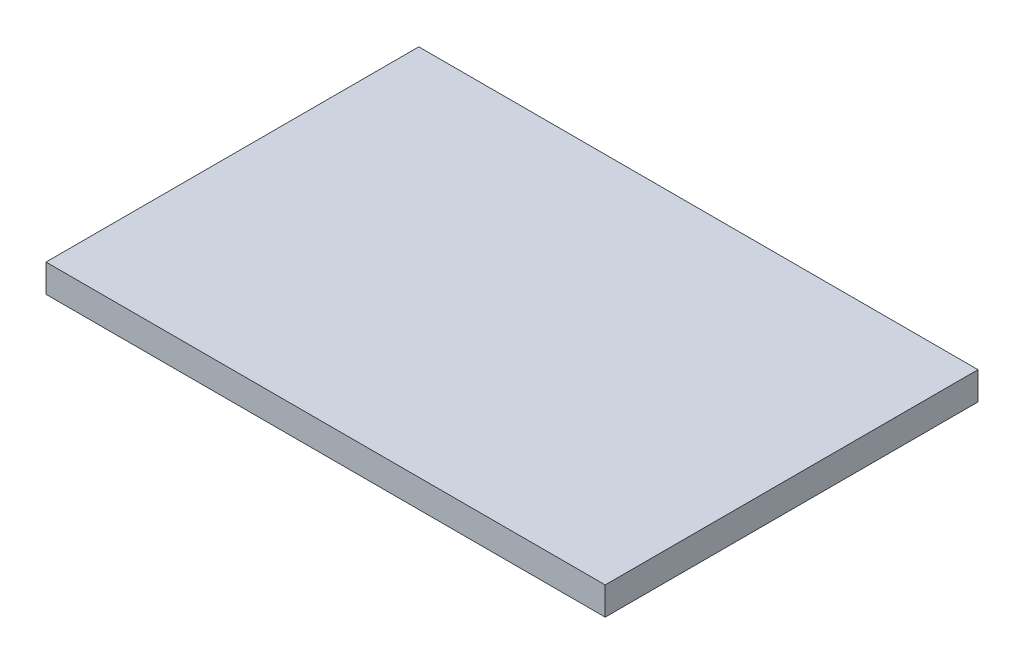
ISO-10303-21;
HEADER;
FILE_DESCRIPTION(('STEP AP214'),'2;1');
FILE_NAME('part.step','',(''),(''),'','','');
FILE_SCHEMA(('AUTOMOTIVE_DESIGN { 1 0 10303 214 1 1 1 1 }'));
ENDSEC;
DATA;
#1=APPLICATION_CONTEXT('core data for automotive mechanical design processes');
#2=APPLICATION_PROTOCOL_DEFINITION('international standard','automotive_design',2000,#1);
#3=PRODUCT_CONTEXT('',#1,'mechanical');
#4=PRODUCT('Part','Part','',(#3));
#5=PRODUCT_RELATED_PRODUCT_CATEGORY('part','',(#4));
#6=PRODUCT_DEFINITION_FORMATION('','',#4);
#7=PRODUCT_DEFINITION_CONTEXT('part definition',#1,'design');
#8=PRODUCT_DEFINITION('design','',#6,#7);
#9=PRODUCT_DEFINITION_SHAPE('','',#8);
#10=(LENGTH_UNIT() NAMED_UNIT(*) SI_UNIT(.MILLI.,.METRE.));
#11=(NAMED_UNIT(*) PLANE_ANGLE_UNIT() SI_UNIT($,.RADIAN.));
#12=(NAMED_UNIT(*) SI_UNIT($,.STERADIAN.) SOLID_ANGLE_UNIT());
#13=UNCERTAINTY_MEASURE_WITH_UNIT(LENGTH_MEASURE(1.E-05),#10,'distance_accuracy_value','');
#14=(GEOMETRIC_REPRESENTATION_CONTEXT(3) GLOBAL_UNCERTAINTY_ASSIGNED_CONTEXT((#13)) GLOBAL_UNIT_ASSIGNED_CONTEXT((#10,
#11,#12)) REPRESENTATION_CONTEXT('',''));
#15=CARTESIAN_POINT('',(0.,0.,0.));
#16=DIRECTION('',(0.,0.,1.));
#17=DIRECTION('',(1.,0.,0.));
#18=AXIS2_PLACEMENT_3D('',#15,#16,#17);
#19=CARTESIAN_POINT('',(30.,3.,-20.));
#20=DIRECTION('',(-1.,0.,0.));
#21=DIRECTION('',(0.,0.,1.));
#22=AXIS2_PLACEMENT_3D('',#19,#20,#21);
#23=PLANE('',#22);
#24=DIRECTION('',(0.,0.,-1.));
#25=VECTOR('',#24,1.);
#26=CARTESIAN_POINT('',(30.,0.,-20.));
#27=LINE('',#26,#25);
#28=CARTESIAN_POINT('',(30.,0.,20.));
#29=VERTEX_POINT('',#28);
#30=CARTESIAN_POINT('',(30.,0.,-20.));
#31=VERTEX_POINT('',#30);
#32=EDGE_CURVE('E96',#29,#31,#27,.T.);
#33=ORIENTED_EDGE('',*,*,#32,.T.);
#34=DIRECTION('',(0.,-1.,0.));
#35=VECTOR('',#34,1.);
#36=CARTESIAN_POINT('',(30.,3.,-20.));
#37=LINE('',#36,#35);
#38=CARTESIAN_POINT('',(30.,3.,-20.));
#39=VERTEX_POINT('',#38);
#40=EDGE_CURVE('E11',#39,#31,#37,.T.);
#41=ORIENTED_EDGE('',*,*,#40,.F.);
#42=DIRECTION('',(0.,0.,-1.));
#43=VECTOR('',#42,1.);
#44=CARTESIAN_POINT('',(30.,3.,-20.));
#45=LINE('',#44,#43);
#46=CARTESIAN_POINT('',(30.,3.,20.));
#47=VERTEX_POINT('',#46);
#48=EDGE_CURVE('E84',#47,#39,#45,.T.);
#49=ORIENTED_EDGE('',*,*,#48,.F.);
#50=DIRECTION('',(0.,-1.,0.));
#51=VECTOR('',#50,1.);
#52=CARTESIAN_POINT('',(30.,3.,20.));
#53=LINE('',#52,#51);
#54=EDGE_CURVE('E92',#47,#29,#53,.T.);
#55=ORIENTED_EDGE('',*,*,#54,.T.);
#56=EDGE_LOOP('',(#33,#41,#49,#55));
#57=FACE_BOUND('',#56,.T.);
#58=ADVANCED_FACE('F33',(#57),#23,.F.);
#59=CARTESIAN_POINT('',(-30.,3.,-20.));
#60=DIRECTION('',(0.,0.,1.));
#61=DIRECTION('',(1.,0.,0.));
#62=AXIS2_PLACEMENT_3D('',#59,#60,#61);
#63=PLANE('',#62);
#64=DIRECTION('',(-1.,0.,0.));
#65=VECTOR('',#64,1.);
#66=CARTESIAN_POINT('',(-30.,0.,-20.));
#67=LINE('',#66,#65);
#68=CARTESIAN_POINT('',(-30.,0.,-20.));
#69=VERTEX_POINT('',#68);
#70=EDGE_CURVE('E88',#31,#69,#67,.T.);
#71=ORIENTED_EDGE('',*,*,#70,.T.);
#72=DIRECTION('',(0.,-1.,0.));
#73=VECTOR('',#72,1.);
#74=CARTESIAN_POINT('',(-30.,3.,-20.));
#75=LINE('',#74,#73);
#76=CARTESIAN_POINT('',(-30.,3.,-20.));
#77=VERTEX_POINT('',#76);
#78=EDGE_CURVE('E41',#77,#69,#75,.T.);
#79=ORIENTED_EDGE('',*,*,#78,.F.);
#80=DIRECTION('',(-1.,0.,0.));
#81=VECTOR('',#80,1.);
#82=CARTESIAN_POINT('',(-30.,3.,-20.));
#83=LINE('',#82,#81);
#84=EDGE_CURVE('E79',#39,#77,#83,.T.);
#85=ORIENTED_EDGE('',*,*,#84,.F.);
#86=ORIENTED_EDGE('',*,*,#40,.T.);
#87=EDGE_LOOP('',(#71,#79,#85,#86));
#88=FACE_BOUND('',#87,.T.);
#89=ADVANCED_FACE('F87',(#88),#63,.F.);
#90=CARTESIAN_POINT('',(-30.,3.,-20.));
#91=DIRECTION('',(1.,0.,0.));
#92=DIRECTION('',(0.,0.,-1.));
#93=AXIS2_PLACEMENT_3D('',#90,#91,#92);
#94=PLANE('',#93);
#95=DIRECTION('',(0.,0.,1.));
#96=VECTOR('',#95,1.);
#97=CARTESIAN_POINT('',(-30.,0.,-20.));
#98=LINE('',#97,#96);
#99=CARTESIAN_POINT('',(-30.,0.,20.));
#100=VERTEX_POINT('',#99);
#101=EDGE_CURVE('E66',#69,#100,#98,.T.);
#102=ORIENTED_EDGE('',*,*,#101,.T.);
#103=DIRECTION('',(0.,-1.,0.));
#104=VECTOR('',#103,1.);
#105=CARTESIAN_POINT('',(-30.,3.,20.));
#106=LINE('',#105,#104);
#107=CARTESIAN_POINT('',(-30.,3.,20.));
#108=VERTEX_POINT('',#107);
#109=EDGE_CURVE('E89',#108,#100,#106,.T.);
#110=ORIENTED_EDGE('',*,*,#109,.F.);
#111=DIRECTION('',(0.,0.,1.));
#112=VECTOR('',#111,1.);
#113=CARTESIAN_POINT('',(-30.,3.,-20.));
#114=LINE('',#113,#112);
#115=EDGE_CURVE('E82',#77,#108,#114,.T.);
#116=ORIENTED_EDGE('',*,*,#115,.F.);
#117=ORIENTED_EDGE('',*,*,#78,.T.);
#118=EDGE_LOOP('',(#102,#110,#116,#117));
#119=FACE_BOUND('',#118,.T.);
#120=ADVANCED_FACE('F90',(#119),#94,.F.);
#121=CARTESIAN_POINT('',(-30.,3.,20.));
#122=DIRECTION('',(0.,0.,-1.));
#123=DIRECTION('',(-1.,0.,0.));
#124=AXIS2_PLACEMENT_3D('',#121,#122,#123);
#125=PLANE('',#124);
#126=DIRECTION('',(1.,0.,0.));
#127=VECTOR('',#126,1.);
#128=CARTESIAN_POINT('',(-30.,0.,20.));
#129=LINE('',#128,#127);
#130=EDGE_CURVE('E72',#100,#29,#129,.T.);
#131=ORIENTED_EDGE('',*,*,#130,.T.);
#132=ORIENTED_EDGE('',*,*,#54,.F.);
#133=DIRECTION('',(1.,0.,0.));
#134=VECTOR('',#133,1.);
#135=CARTESIAN_POINT('',(-30.,3.,20.));
#136=LINE('',#135,#134);
#137=EDGE_CURVE('E49',#108,#47,#136,.T.);
#138=ORIENTED_EDGE('',*,*,#137,.F.);
#139=ORIENTED_EDGE('',*,*,#109,.T.);
#140=EDGE_LOOP('',(#131,#132,#138,#139));
#141=FACE_BOUND('',#140,.T.);
#142=ADVANCED_FACE('F103',(#141),#125,.F.);
#143=CARTESIAN_POINT('',(0.,3.,0.));
#144=DIRECTION('',(0.,1.,0.));
#145=DIRECTION('',(0.,0.,1.));
#146=AXIS2_PLACEMENT_3D('',#143,#144,#145);
#147=PLANE('',#146);
#148=ORIENTED_EDGE('',*,*,#48,.T.);
#149=ORIENTED_EDGE('',*,*,#84,.T.);
#150=ORIENTED_EDGE('',*,*,#115,.T.);
#151=ORIENTED_EDGE('',*,*,#137,.T.);
#152=EDGE_LOOP('',(#148,#149,#150,#151));
#153=FACE_BOUND('',#152,.T.);
#154=ADVANCED_FACE('F80',(#153),#147,.T.);
#155=CARTESIAN_POINT('',(0.,0.,0.));
#156=DIRECTION('',(0.,1.,0.));
#157=DIRECTION('',(0.,0.,1.));
#158=AXIS2_PLACEMENT_3D('',#155,#156,#157);
#159=PLANE('',#158);
#160=ORIENTED_EDGE('',*,*,#32,.F.);
#161=ORIENTED_EDGE('',*,*,#130,.F.);
#162=ORIENTED_EDGE('',*,*,#101,.F.);
#163=ORIENTED_EDGE('',*,*,#70,.F.);
#164=EDGE_LOOP('',(#160,#161,#162,#163));
#165=FACE_BOUND('',#164,.T.);
#166=ADVANCED_FACE('F106',(#165),#159,.F.);
#167=CLOSED_SHELL('',(#58,#89,#120,#142,#154,#166));
#168=MANIFOLD_SOLID_BREP('B2',#167);
#169=ADVANCED_BREP_SHAPE_REPRESENTATION('',(#18,#168),#14);
#170=SHAPE_DEFINITION_REPRESENTATION(#9,#169);
ENDSEC;
END-ISO-10303-21;
